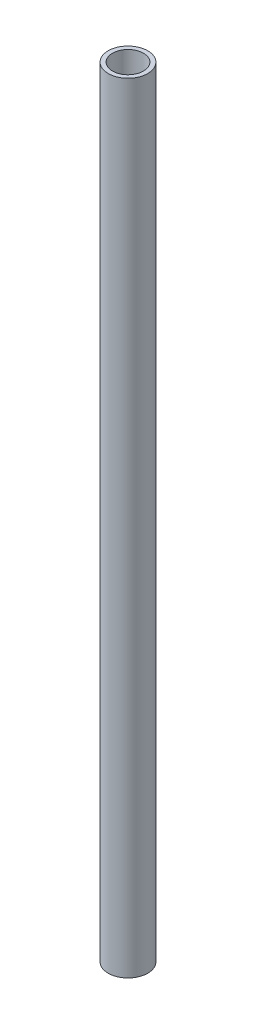
ISO-10303-21;
HEADER;
FILE_DESCRIPTION(('STEP AP214'),'2;1');
FILE_NAME('part.step','',(''),(''),'','','');
FILE_SCHEMA(('AUTOMOTIVE_DESIGN { 1 0 10303 214 1 1 1 1 }'));
ENDSEC;
DATA;
#1=APPLICATION_CONTEXT('core data for automotive mechanical design processes');
#2=APPLICATION_PROTOCOL_DEFINITION('international standard','automotive_design',2000,#1);
#3=PRODUCT_CONTEXT('',#1,'mechanical');
#4=PRODUCT('Part','Part','',(#3));
#5=PRODUCT_RELATED_PRODUCT_CATEGORY('part','',(#4));
#6=PRODUCT_DEFINITION_FORMATION('','',#4);
#7=PRODUCT_DEFINITION_CONTEXT('part definition',#1,'design');
#8=PRODUCT_DEFINITION('design','',#6,#7);
#9=PRODUCT_DEFINITION_SHAPE('','',#8);
#10=(LENGTH_UNIT() NAMED_UNIT(*) SI_UNIT(.MILLI.,.METRE.));
#11=(NAMED_UNIT(*) PLANE_ANGLE_UNIT() SI_UNIT($,.RADIAN.));
#12=(NAMED_UNIT(*) SI_UNIT($,.STERADIAN.) SOLID_ANGLE_UNIT());
#13=UNCERTAINTY_MEASURE_WITH_UNIT(LENGTH_MEASURE(1.E-05),#10,'distance_accuracy_value','');
#14=(GEOMETRIC_REPRESENTATION_CONTEXT(3) GLOBAL_UNCERTAINTY_ASSIGNED_CONTEXT((#13)) GLOBAL_UNIT_ASSIGNED_CONTEXT((#10,
#11,#12)) REPRESENTATION_CONTEXT('',''));
#15=CARTESIAN_POINT('',(0.,0.,0.));
#16=DIRECTION('',(0.,0.,1.));
#17=DIRECTION('',(1.,0.,0.));
#18=AXIS2_PLACEMENT_3D('',#15,#16,#17);
#19=CARTESIAN_POINT('',(0.,420.,0.));
#20=DIRECTION('',(0.,-1.,0.));
#21=DIRECTION('',(0.,0.,-1.));
#22=AXIS2_PLACEMENT_3D('',#19,#20,#21);
#23=CYLINDRICAL_SURFACE('',#22,8.35);
#24=CARTESIAN_POINT('',(0.,420.,0.));
#25=DIRECTION('',(0.,1.,0.));
#26=DIRECTION('',(0.,0.,1.));
#27=AXIS2_PLACEMENT_3D('',#24,#25,#26);
#28=CIRCLE('',#27,8.35);
#29=CARTESIAN_POINT('',(0.,420.,8.35));
#30=VERTEX_POINT('',#29);
#31=EDGE_CURVE('E52',#30,#30,#28,.T.);
#32=ORIENTED_EDGE('',*,*,#31,.T.);
#33=EDGE_LOOP('',(#32));
#34=FACE_BOUND('',#33,.T.);
#35=CARTESIAN_POINT('',(0.,0.,0.));
#36=DIRECTION('',(0.,1.,0.));
#37=DIRECTION('',(0.,0.,1.));
#38=AXIS2_PLACEMENT_3D('',#35,#36,#37);
#39=CIRCLE('',#38,8.35);
#40=CARTESIAN_POINT('',(0.,0.,8.35));
#41=VERTEX_POINT('',#40);
#42=EDGE_CURVE('E59',#41,#41,#39,.T.);
#43=ORIENTED_EDGE('',*,*,#42,.F.);
#44=EDGE_LOOP('',(#43));
#45=FACE_BOUND('',#44,.T.);
#46=ADVANCED_FACE('F44',(#34,#45),#23,.F.);
#47=CARTESIAN_POINT('',(0.,420.,0.));
#48=DIRECTION('',(0.,-1.,0.));
#49=DIRECTION('',(0.,0.,-1.));
#50=AXIS2_PLACEMENT_3D('',#47,#48,#49);
#51=CYLINDRICAL_SURFACE('',#50,10.65);
#52=CARTESIAN_POINT('',(0.,420.,0.));
#53=DIRECTION('',(0.,1.,0.));
#54=DIRECTION('',(0.,0.,1.));
#55=AXIS2_PLACEMENT_3D('',#52,#53,#54);
#56=CIRCLE('',#55,10.65);
#57=CARTESIAN_POINT('',(0.,420.,10.65));
#58=VERTEX_POINT('',#57);
#59=EDGE_CURVE('E11',#58,#58,#56,.T.);
#60=ORIENTED_EDGE('',*,*,#59,.F.);
#61=EDGE_LOOP('',(#60));
#62=FACE_BOUND('',#61,.T.);
#63=CARTESIAN_POINT('',(0.,0.,0.));
#64=DIRECTION('',(0.,1.,0.));
#65=DIRECTION('',(0.,0.,1.));
#66=AXIS2_PLACEMENT_3D('',#63,#64,#65);
#67=CIRCLE('',#66,10.65);
#68=CARTESIAN_POINT('',(0.,0.,10.65));
#69=VERTEX_POINT('',#68);
#70=EDGE_CURVE('E47',#69,#69,#67,.T.);
#71=ORIENTED_EDGE('',*,*,#70,.T.);
#72=EDGE_LOOP('',(#71));
#73=FACE_BOUND('',#72,.T.);
#74=ADVANCED_FACE('F68',(#62,#73),#51,.T.);
#75=CARTESIAN_POINT('',(0.,420.,0.));
#76=DIRECTION('',(0.,1.,0.));
#77=DIRECTION('',(0.,0.,1.));
#78=AXIS2_PLACEMENT_3D('',#75,#76,#77);
#79=PLANE('',#78);
#80=ORIENTED_EDGE('',*,*,#31,.F.);
#81=EDGE_LOOP('',(#80));
#82=FACE_BOUND('',#81,.T.);
#83=ORIENTED_EDGE('',*,*,#59,.T.);
#84=EDGE_LOOP('',(#83));
#85=FACE_BOUND('',#84,.T.);
#86=ADVANCED_FACE('F72',(#82,#85),#79,.T.);
#87=CARTESIAN_POINT('',(0.,0.,0.));
#88=DIRECTION('',(0.,1.,0.));
#89=DIRECTION('',(0.,0.,1.));
#90=AXIS2_PLACEMENT_3D('',#87,#88,#89);
#91=PLANE('',#90);
#92=ORIENTED_EDGE('',*,*,#42,.T.);
#93=EDGE_LOOP('',(#92));
#94=FACE_BOUND('',#93,.T.);
#95=ORIENTED_EDGE('',*,*,#70,.F.);
#96=EDGE_LOOP('',(#95));
#97=FACE_BOUND('',#96,.T.);
#98=ADVANCED_FACE('F70',(#94,#97),#91,.F.);
#99=CLOSED_SHELL('',(#46,#74,#86,#98));
#100=MANIFOLD_SOLID_BREP('B2',#99);
#101=ADVANCED_BREP_SHAPE_REPRESENTATION('',(#18,#100),#14);
#102=SHAPE_DEFINITION_REPRESENTATION(#9,#101);
ENDSEC;
END-ISO-10303-21;
